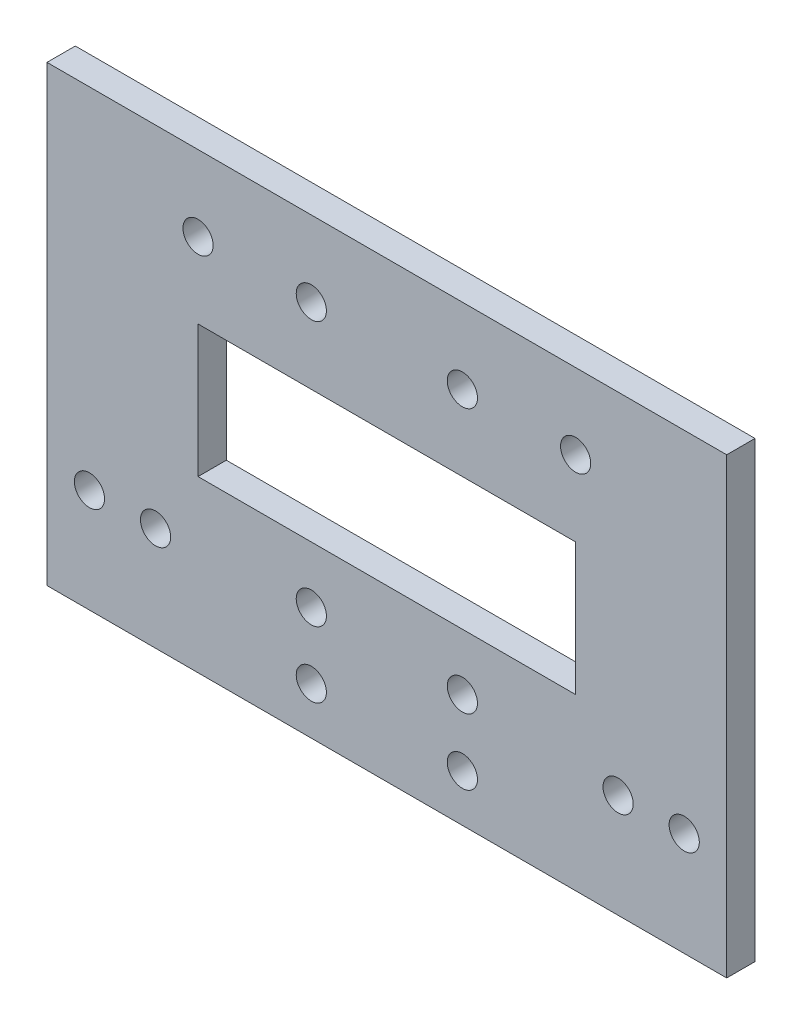
ISO-10303-21;
HEADER;
FILE_DESCRIPTION(('STEP AP214'),'2;1');
FILE_NAME('part.step','',(''),(''),'','','');
FILE_SCHEMA(('AUTOMOTIVE_DESIGN { 1 0 10303 214 1 1 1 1 }'));
ENDSEC;
DATA;
#1=APPLICATION_CONTEXT('core data for automotive mechanical design processes');
#2=APPLICATION_PROTOCOL_DEFINITION('international standard','automotive_design',2000,#1);
#3=PRODUCT_CONTEXT('',#1,'mechanical');
#4=PRODUCT('Part','Part','',(#3));
#5=PRODUCT_RELATED_PRODUCT_CATEGORY('part','',(#4));
#6=PRODUCT_DEFINITION_FORMATION('','',#4);
#7=PRODUCT_DEFINITION_CONTEXT('part definition',#1,'design');
#8=PRODUCT_DEFINITION('design','',#6,#7);
#9=PRODUCT_DEFINITION_SHAPE('','',#8);
#10=(LENGTH_UNIT() NAMED_UNIT(*) SI_UNIT(.MILLI.,.METRE.));
#11=(NAMED_UNIT(*) PLANE_ANGLE_UNIT() SI_UNIT($,.RADIAN.));
#12=(NAMED_UNIT(*) SI_UNIT($,.STERADIAN.) SOLID_ANGLE_UNIT());
#13=UNCERTAINTY_MEASURE_WITH_UNIT(LENGTH_MEASURE(1.E-05),#10,'distance_accuracy_value','');
#14=(GEOMETRIC_REPRESENTATION_CONTEXT(3) GLOBAL_UNCERTAINTY_ASSIGNED_CONTEXT((#13)) GLOBAL_UNIT_ASSIGNED_CONTEXT((#10,
#11,#12)) REPRESENTATION_CONTEXT('',''));
#15=CARTESIAN_POINT('',(0.,0.,0.));
#16=DIRECTION('',(0.,0.,1.));
#17=DIRECTION('',(1.,0.,0.));
#18=AXIS2_PLACEMENT_3D('',#15,#16,#17);
#19=CARTESIAN_POINT('',(0.,0.,3.));
#20=DIRECTION('',(0.,0.,-1.));
#21=DIRECTION('',(-1.,0.,0.));
#22=AXIS2_PLACEMENT_3D('',#19,#20,#21);
#23=PLANE('',#22);
#24=CARTESIAN_POINT('',(67.5,11.,3.));
#25=DIRECTION('',(0.,0.,1.));
#26=DIRECTION('',(1.,0.,0.));
#27=AXIS2_PLACEMENT_3D('',#24,#25,#26);
#28=CIRCLE('',#27,1.6);
#29=CARTESIAN_POINT('',(69.1,11.,3.));
#30=VERTEX_POINT('',#29);
#31=EDGE_CURVE('E272',#30,#30,#28,.T.);
#32=ORIENTED_EDGE('',*,*,#31,.F.);
#33=EDGE_LOOP('',(#32));
#34=FACE_BOUND('',#33,.T.);
#35=CARTESIAN_POINT('',(11.5,11.,3.));
#36=DIRECTION('',(0.,0.,1.));
#37=DIRECTION('',(1.,0.,0.));
#38=AXIS2_PLACEMENT_3D('',#35,#36,#37);
#39=CIRCLE('',#38,1.6);
#40=CARTESIAN_POINT('',(13.1,11.,3.));
#41=VERTEX_POINT('',#40);
#42=EDGE_CURVE('E285',#41,#41,#39,.T.);
#43=ORIENTED_EDGE('',*,*,#42,.F.);
#44=EDGE_LOOP('',(#43));
#45=FACE_BOUND('',#44,.T.);
#46=CARTESIAN_POINT('',(4.49999999999998,11.,3.));
#47=DIRECTION('',(0.,0.,1.));
#48=DIRECTION('',(1.,0.,0.));
#49=AXIS2_PLACEMENT_3D('',#46,#47,#48);
#50=CIRCLE('',#49,1.6);
#51=CARTESIAN_POINT('',(6.09999999999998,11.,3.));
#52=VERTEX_POINT('',#51);
#53=EDGE_CURVE('E284',#52,#52,#50,.T.);
#54=ORIENTED_EDGE('',*,*,#53,.F.);
#55=EDGE_LOOP('',(#54));
#56=FACE_BOUND('',#55,.T.);
#57=CARTESIAN_POINT('',(60.5,11.,3.));
#58=DIRECTION('',(0.,0.,1.));
#59=DIRECTION('',(1.,0.,0.));
#60=AXIS2_PLACEMENT_3D('',#57,#58,#59);
#61=CIRCLE('',#60,1.6);
#62=CARTESIAN_POINT('',(62.1,11.,3.));
#63=VERTEX_POINT('',#62);
#64=EDGE_CURVE('E278',#63,#63,#61,.T.);
#65=ORIENTED_EDGE('',*,*,#64,.F.);
#66=EDGE_LOOP('',(#65));
#67=FACE_BOUND('',#66,.T.);
#68=CARTESIAN_POINT('',(56.,40.,3.));
#69=DIRECTION('',(0.,0.,-1.));
#70=DIRECTION('',(-1.,0.,0.));
#71=AXIS2_PLACEMENT_3D('',#68,#69,#70);
#72=CIRCLE('',#71,1.6);
#73=CARTESIAN_POINT('',(54.4,40.,3.));
#74=VERTEX_POINT('',#73);
#75=EDGE_CURVE('E128',#74,#74,#72,.T.);
#76=ORIENTED_EDGE('',*,*,#75,.T.);
#77=EDGE_LOOP('',(#76));
#78=FACE_BOUND('',#77,.T.);
#79=CARTESIAN_POINT('',(28.,40.,3.));
#80=DIRECTION('',(0.,0.,-1.));
#81=DIRECTION('',(-1.,0.,0.));
#82=AXIS2_PLACEMENT_3D('',#79,#80,#81);
#83=CIRCLE('',#82,1.6);
#84=CARTESIAN_POINT('',(26.4,40.,3.));
#85=VERTEX_POINT('',#84);
#86=EDGE_CURVE('E336',#85,#85,#83,.T.);
#87=ORIENTED_EDGE('',*,*,#86,.T.);
#88=EDGE_LOOP('',(#87));
#89=FACE_BOUND('',#88,.T.);
#90=CARTESIAN_POINT('',(44.,40.,3.));
#91=DIRECTION('',(0.,0.,-1.));
#92=DIRECTION('',(-1.,0.,0.));
#93=AXIS2_PLACEMENT_3D('',#90,#91,#92);
#94=CIRCLE('',#93,1.6);
#95=CARTESIAN_POINT('',(42.4,40.,3.));
#96=VERTEX_POINT('',#95);
#97=EDGE_CURVE('E333',#96,#96,#94,.T.);
#98=ORIENTED_EDGE('',*,*,#97,.T.);
#99=EDGE_LOOP('',(#98));
#100=FACE_BOUND('',#99,.T.);
#101=CARTESIAN_POINT('',(28.,12.,3.));
#102=DIRECTION('',(0.,0.,-1.));
#103=DIRECTION('',(-1.,0.,0.));
#104=AXIS2_PLACEMENT_3D('',#101,#102,#103);
#105=CIRCLE('',#104,1.6);
#106=CARTESIAN_POINT('',(26.4,12.,3.));
#107=VERTEX_POINT('',#106);
#108=EDGE_CURVE('E330',#107,#107,#105,.T.);
#109=ORIENTED_EDGE('',*,*,#108,.T.);
#110=EDGE_LOOP('',(#109));
#111=FACE_BOUND('',#110,.T.);
#112=CARTESIAN_POINT('',(28.,5.,3.));
#113=DIRECTION('',(0.,0.,-1.));
#114=DIRECTION('',(-1.,0.,0.));
#115=AXIS2_PLACEMENT_3D('',#112,#113,#114);
#116=CIRCLE('',#115,1.6);
#117=CARTESIAN_POINT('',(26.4,5.,3.));
#118=VERTEX_POINT('',#117);
#119=EDGE_CURVE('E327',#118,#118,#116,.T.);
#120=ORIENTED_EDGE('',*,*,#119,.T.);
#121=EDGE_LOOP('',(#120));
#122=FACE_BOUND('',#121,.T.);
#123=CARTESIAN_POINT('',(44.,5.,3.));
#124=DIRECTION('',(0.,0.,-1.));
#125=DIRECTION('',(-1.,0.,0.));
#126=AXIS2_PLACEMENT_3D('',#123,#124,#125);
#127=CIRCLE('',#126,1.6);
#128=CARTESIAN_POINT('',(42.4,5.,3.));
#129=VERTEX_POINT('',#128);
#130=EDGE_CURVE('E324',#129,#129,#127,.T.);
#131=ORIENTED_EDGE('',*,*,#130,.T.);
#132=EDGE_LOOP('',(#131));
#133=FACE_BOUND('',#132,.T.);
#134=CARTESIAN_POINT('',(16.,40.,3.));
#135=DIRECTION('',(0.,0.,-1.));
#136=DIRECTION('',(-1.,0.,0.));
#137=AXIS2_PLACEMENT_3D('',#134,#135,#136);
#138=CIRCLE('',#137,1.6);
#139=CARTESIAN_POINT('',(14.4,40.,3.));
#140=VERTEX_POINT('',#139);
#141=EDGE_CURVE('E321',#140,#140,#138,.T.);
#142=ORIENTED_EDGE('',*,*,#141,.T.);
#143=EDGE_LOOP('',(#142));
#144=FACE_BOUND('',#143,.T.);
#145=CARTESIAN_POINT('',(44.,12.,3.));
#146=DIRECTION('',(0.,0.,-1.));
#147=DIRECTION('',(-1.,0.,0.));
#148=AXIS2_PLACEMENT_3D('',#145,#146,#147);
#149=CIRCLE('',#148,1.6);
#150=CARTESIAN_POINT('',(42.4,12.,3.));
#151=VERTEX_POINT('',#150);
#152=EDGE_CURVE('E318',#151,#151,#149,.T.);
#153=ORIENTED_EDGE('',*,*,#152,.T.);
#154=EDGE_LOOP('',(#153));
#155=FACE_BOUND('',#154,.T.);
#156=DIRECTION('',(1.,0.,0.));
#157=VECTOR('',#156,1.);
#158=CARTESIAN_POINT('',(16.,0.,3.));
#159=LINE('',#158,#157);
#160=CARTESIAN_POINT('',(0.,0.,3.));
#161=VERTEX_POINT('',#160);
#162=CARTESIAN_POINT('',(72.,0.,3.));
#163=VERTEX_POINT('',#162);
#164=EDGE_CURVE('E138',#161,#163,#159,.T.);
#165=ORIENTED_EDGE('',*,*,#164,.T.);
#166=DIRECTION('',(0.,1.,0.));
#167=VECTOR('',#166,1.);
#168=CARTESIAN_POINT('',(72.,48.,3.));
#169=LINE('',#168,#167);
#170=CARTESIAN_POINT('',(72.,48.,3.));
#171=VERTEX_POINT('',#170);
#172=EDGE_CURVE('E140',#163,#171,#169,.T.);
#173=ORIENTED_EDGE('',*,*,#172,.T.);
#174=DIRECTION('',(-1.,0.,0.));
#175=VECTOR('',#174,1.);
#176=CARTESIAN_POINT('',(0.,48.,3.));
#177=LINE('',#176,#175);
#178=CARTESIAN_POINT('',(0.,48.,3.));
#179=VERTEX_POINT('',#178);
#180=EDGE_CURVE('E143',#171,#179,#177,.T.);
#181=ORIENTED_EDGE('',*,*,#180,.T.);
#182=DIRECTION('',(0.,-1.,0.));
#183=VECTOR('',#182,1.);
#184=CARTESIAN_POINT('',(0.,0.,3.));
#185=LINE('',#184,#183);
#186=EDGE_CURVE('E145',#179,#161,#185,.T.);
#187=ORIENTED_EDGE('',*,*,#186,.T.);
#188=EDGE_LOOP('',(#165,#173,#181,#187));
#189=FACE_BOUND('',#188,.T.);
#190=DIRECTION('',(0.,-1.,0.));
#191=VECTOR('',#190,1.);
#192=CARTESIAN_POINT('',(16.,18.,3.));
#193=LINE('',#192,#191);
#194=CARTESIAN_POINT('',(16.,32.,3.));
#195=VERTEX_POINT('',#194);
#196=CARTESIAN_POINT('',(16.,18.,3.));
#197=VERTEX_POINT('',#196);
#198=EDGE_CURVE('E100',#195,#197,#193,.T.);
#199=ORIENTED_EDGE('',*,*,#198,.F.);
#200=DIRECTION('',(-1.,0.,0.));
#201=VECTOR('',#200,1.);
#202=CARTESIAN_POINT('',(56.,32.,3.));
#203=LINE('',#202,#201);
#204=CARTESIAN_POINT('',(56.,32.,3.));
#205=VERTEX_POINT('',#204);
#206=EDGE_CURVE('E122',#205,#195,#203,.T.);
#207=ORIENTED_EDGE('',*,*,#206,.F.);
#208=DIRECTION('',(0.,1.,0.));
#209=VECTOR('',#208,1.);
#210=CARTESIAN_POINT('',(56.,32.,3.));
#211=LINE('',#210,#209);
#212=CARTESIAN_POINT('',(56.,18.,3.));
#213=VERTEX_POINT('',#212);
#214=EDGE_CURVE('E120',#213,#205,#211,.T.);
#215=ORIENTED_EDGE('',*,*,#214,.F.);
#216=DIRECTION('',(1.,0.,0.));
#217=VECTOR('',#216,1.);
#218=CARTESIAN_POINT('',(16.,18.,3.));
#219=LINE('',#218,#217);
#220=EDGE_CURVE('E108',#197,#213,#219,.T.);
#221=ORIENTED_EDGE('',*,*,#220,.F.);
#222=EDGE_LOOP('',(#199,#207,#215,#221));
#223=FACE_BOUND('',#222,.T.);
#224=ADVANCED_FACE('F35',(#34,#45,#56,#67,#78,#89,#100,#111,#122,#133,#144,#155,#189,#223),#23,.F.);
#225=CARTESIAN_POINT('',(0.,0.,0.));
#226=DIRECTION('',(0.,0.,-1.));
#227=DIRECTION('',(-1.,0.,0.));
#228=AXIS2_PLACEMENT_3D('',#225,#226,#227);
#229=PLANE('',#228);
#230=CARTESIAN_POINT('',(67.5,11.,0.));
#231=DIRECTION('',(0.,0.,1.));
#232=DIRECTION('',(1.,0.,0.));
#233=AXIS2_PLACEMENT_3D('',#230,#231,#232);
#234=CIRCLE('',#233,1.6);
#235=CARTESIAN_POINT('',(69.1,11.,0.));
#236=VERTEX_POINT('',#235);
#237=EDGE_CURVE('E270',#236,#236,#234,.T.);
#238=ORIENTED_EDGE('',*,*,#237,.T.);
#239=EDGE_LOOP('',(#238));
#240=FACE_BOUND('',#239,.T.);
#241=CARTESIAN_POINT('',(11.5,11.,0.));
#242=DIRECTION('',(0.,0.,1.));
#243=DIRECTION('',(1.,0.,0.));
#244=AXIS2_PLACEMENT_3D('',#241,#242,#243);
#245=CIRCLE('',#244,1.6);
#246=CARTESIAN_POINT('',(13.1,11.,0.));
#247=VERTEX_POINT('',#246);
#248=EDGE_CURVE('E281',#247,#247,#245,.T.);
#249=ORIENTED_EDGE('',*,*,#248,.T.);
#250=EDGE_LOOP('',(#249));
#251=FACE_BOUND('',#250,.T.);
#252=CARTESIAN_POINT('',(4.49999999999998,11.,0.));
#253=DIRECTION('',(0.,0.,1.));
#254=DIRECTION('',(1.,0.,0.));
#255=AXIS2_PLACEMENT_3D('',#252,#253,#254);
#256=CIRCLE('',#255,1.6);
#257=CARTESIAN_POINT('',(6.09999999999998,11.,0.));
#258=VERTEX_POINT('',#257);
#259=EDGE_CURVE('E290',#258,#258,#256,.T.);
#260=ORIENTED_EDGE('',*,*,#259,.T.);
#261=EDGE_LOOP('',(#260));
#262=FACE_BOUND('',#261,.T.);
#263=CARTESIAN_POINT('',(60.5,11.,0.));
#264=DIRECTION('',(0.,0.,1.));
#265=DIRECTION('',(1.,0.,0.));
#266=AXIS2_PLACEMENT_3D('',#263,#264,#265);
#267=CIRCLE('',#266,1.6);
#268=CARTESIAN_POINT('',(62.1,11.,0.));
#269=VERTEX_POINT('',#268);
#270=EDGE_CURVE('E273',#269,#269,#267,.T.);
#271=ORIENTED_EDGE('',*,*,#270,.T.);
#272=EDGE_LOOP('',(#271));
#273=FACE_BOUND('',#272,.T.);
#274=CARTESIAN_POINT('',(56.,40.,0.));
#275=DIRECTION('',(0.,0.,-1.));
#276=DIRECTION('',(-1.,0.,0.));
#277=AXIS2_PLACEMENT_3D('',#274,#275,#276);
#278=CIRCLE('',#277,1.6);
#279=CARTESIAN_POINT('',(54.4,40.,0.));
#280=VERTEX_POINT('',#279);
#281=EDGE_CURVE('E301',#280,#280,#278,.T.);
#282=ORIENTED_EDGE('',*,*,#281,.F.);
#283=EDGE_LOOP('',(#282));
#284=FACE_BOUND('',#283,.T.);
#285=CARTESIAN_POINT('',(28.,40.,0.));
#286=DIRECTION('',(0.,0.,-1.));
#287=DIRECTION('',(-1.,0.,0.));
#288=AXIS2_PLACEMENT_3D('',#285,#286,#287);
#289=CIRCLE('',#288,1.6);
#290=CARTESIAN_POINT('',(26.4,40.,0.));
#291=VERTEX_POINT('',#290);
#292=EDGE_CURVE('E304',#291,#291,#289,.T.);
#293=ORIENTED_EDGE('',*,*,#292,.F.);
#294=EDGE_LOOP('',(#293));
#295=FACE_BOUND('',#294,.T.);
#296=CARTESIAN_POINT('',(44.,40.,0.));
#297=DIRECTION('',(0.,0.,-1.));
#298=DIRECTION('',(-1.,0.,0.));
#299=AXIS2_PLACEMENT_3D('',#296,#297,#298);
#300=CIRCLE('',#299,1.6);
#301=CARTESIAN_POINT('',(42.4,40.,0.));
#302=VERTEX_POINT('',#301);
#303=EDGE_CURVE('E307',#302,#302,#300,.T.);
#304=ORIENTED_EDGE('',*,*,#303,.F.);
#305=EDGE_LOOP('',(#304));
#306=FACE_BOUND('',#305,.T.);
#307=CARTESIAN_POINT('',(28.,12.,0.));
#308=DIRECTION('',(0.,0.,-1.));
#309=DIRECTION('',(-1.,0.,0.));
#310=AXIS2_PLACEMENT_3D('',#307,#308,#309);
#311=CIRCLE('',#310,1.6);
#312=CARTESIAN_POINT('',(26.4,12.,0.));
#313=VERTEX_POINT('',#312);
#314=EDGE_CURVE('E310',#313,#313,#311,.T.);
#315=ORIENTED_EDGE('',*,*,#314,.F.);
#316=EDGE_LOOP('',(#315));
#317=FACE_BOUND('',#316,.T.);
#318=CARTESIAN_POINT('',(28.,5.,0.));
#319=DIRECTION('',(0.,0.,-1.));
#320=DIRECTION('',(-1.,0.,0.));
#321=AXIS2_PLACEMENT_3D('',#318,#319,#320);
#322=CIRCLE('',#321,1.6);
#323=CARTESIAN_POINT('',(26.4,5.,0.));
#324=VERTEX_POINT('',#323);
#325=EDGE_CURVE('E275',#324,#324,#322,.T.);
#326=ORIENTED_EDGE('',*,*,#325,.F.);
#327=EDGE_LOOP('',(#326));
#328=FACE_BOUND('',#327,.T.);
#329=CARTESIAN_POINT('',(44.,5.,0.));
#330=DIRECTION('',(0.,0.,-1.));
#331=DIRECTION('',(-1.,0.,0.));
#332=AXIS2_PLACEMENT_3D('',#329,#330,#331);
#333=CIRCLE('',#332,1.6);
#334=CARTESIAN_POINT('',(42.4,5.,0.));
#335=VERTEX_POINT('',#334);
#336=EDGE_CURVE('E297',#335,#335,#333,.T.);
#337=ORIENTED_EDGE('',*,*,#336,.F.);
#338=EDGE_LOOP('',(#337));
#339=FACE_BOUND('',#338,.T.);
#340=CARTESIAN_POINT('',(16.,40.,0.));
#341=DIRECTION('',(0.,0.,-1.));
#342=DIRECTION('',(-1.,0.,0.));
#343=AXIS2_PLACEMENT_3D('',#340,#341,#342);
#344=CIRCLE('',#343,1.6);
#345=CARTESIAN_POINT('',(14.4,40.,0.));
#346=VERTEX_POINT('',#345);
#347=EDGE_CURVE('E298',#346,#346,#344,.T.);
#348=ORIENTED_EDGE('',*,*,#347,.F.);
#349=EDGE_LOOP('',(#348));
#350=FACE_BOUND('',#349,.T.);
#351=CARTESIAN_POINT('',(44.,12.,0.));
#352=DIRECTION('',(0.,0.,-1.));
#353=DIRECTION('',(-1.,0.,0.));
#354=AXIS2_PLACEMENT_3D('',#351,#352,#353);
#355=CIRCLE('',#354,1.6);
#356=CARTESIAN_POINT('',(42.4,12.,0.));
#357=VERTEX_POINT('',#356);
#358=EDGE_CURVE('E313',#357,#357,#355,.T.);
#359=ORIENTED_EDGE('',*,*,#358,.F.);
#360=EDGE_LOOP('',(#359));
#361=FACE_BOUND('',#360,.T.);
#362=DIRECTION('',(1.,0.,0.));
#363=VECTOR('',#362,1.);
#364=CARTESIAN_POINT('',(72.,0.,0.));
#365=LINE('',#364,#363);
#366=CARTESIAN_POINT('',(0.,0.,0.));
#367=VERTEX_POINT('',#366);
#368=CARTESIAN_POINT('',(72.,0.,0.));
#369=VERTEX_POINT('',#368);
#370=EDGE_CURVE('E116',#367,#369,#365,.T.);
#371=ORIENTED_EDGE('',*,*,#370,.F.);
#372=DIRECTION('',(0.,-1.,0.));
#373=VECTOR('',#372,1.);
#374=CARTESIAN_POINT('',(0.,0.,0.));
#375=LINE('',#374,#373);
#376=CARTESIAN_POINT('',(0.,48.,0.));
#377=VERTEX_POINT('',#376);
#378=EDGE_CURVE('E141',#377,#367,#375,.T.);
#379=ORIENTED_EDGE('',*,*,#378,.F.);
#380=DIRECTION('',(-1.,0.,0.));
#381=VECTOR('',#380,1.);
#382=CARTESIAN_POINT('',(0.,48.,0.));
#383=LINE('',#382,#381);
#384=CARTESIAN_POINT('',(72.,48.,0.));
#385=VERTEX_POINT('',#384);
#386=EDGE_CURVE('E151',#385,#377,#383,.T.);
#387=ORIENTED_EDGE('',*,*,#386,.F.);
#388=DIRECTION('',(0.,1.,0.));
#389=VECTOR('',#388,1.);
#390=CARTESIAN_POINT('',(72.,48.,0.));
#391=LINE('',#390,#389);
#392=EDGE_CURVE('E149',#369,#385,#391,.T.);
#393=ORIENTED_EDGE('',*,*,#392,.F.);
#394=EDGE_LOOP('',(#371,#379,#387,#393));
#395=FACE_BOUND('',#394,.T.);
#396=DIRECTION('',(-1.,0.,0.));
#397=VECTOR('',#396,1.);
#398=CARTESIAN_POINT('',(56.,32.,0.));
#399=LINE('',#398,#397);
#400=CARTESIAN_POINT('',(56.,32.,0.));
#401=VERTEX_POINT('',#400);
#402=CARTESIAN_POINT('',(16.,32.,0.));
#403=VERTEX_POINT('',#402);
#404=EDGE_CURVE('E109',#401,#403,#399,.T.);
#405=ORIENTED_EDGE('',*,*,#404,.T.);
#406=DIRECTION('',(0.,-1.,0.));
#407=VECTOR('',#406,1.);
#408=CARTESIAN_POINT('',(16.,18.,0.));
#409=LINE('',#408,#407);
#410=CARTESIAN_POINT('',(16.,18.,0.));
#411=VERTEX_POINT('',#410);
#412=EDGE_CURVE('E58',#403,#411,#409,.T.);
#413=ORIENTED_EDGE('',*,*,#412,.T.);
#414=DIRECTION('',(1.,0.,0.));
#415=VECTOR('',#414,1.);
#416=CARTESIAN_POINT('',(16.,18.,0.));
#417=LINE('',#416,#415);
#418=CARTESIAN_POINT('',(56.,18.,0.));
#419=VERTEX_POINT('',#418);
#420=EDGE_CURVE('E115',#411,#419,#417,.T.);
#421=ORIENTED_EDGE('',*,*,#420,.T.);
#422=DIRECTION('',(0.,1.,0.));
#423=VECTOR('',#422,1.);
#424=CARTESIAN_POINT('',(56.,32.,0.));
#425=LINE('',#424,#423);
#426=EDGE_CURVE('E130',#419,#401,#425,.T.);
#427=ORIENTED_EDGE('',*,*,#426,.T.);
#428=EDGE_LOOP('',(#405,#413,#421,#427));
#429=FACE_BOUND('',#428,.T.);
#430=ADVANCED_FACE('F171',(#240,#251,#262,#273,#284,#295,#306,#317,#328,#339,#350,#361,#395,
#429),#229,.T.);
#431=CARTESIAN_POINT('',(72.,0.,3.));
#432=DIRECTION('',(0.,1.,0.));
#433=DIRECTION('',(-1.,0.,0.));
#434=AXIS2_PLACEMENT_3D('',#431,#432,#433);
#435=PLANE('',#434);
#436=ORIENTED_EDGE('',*,*,#370,.T.);
#437=DIRECTION('',(0.,0.,-1.));
#438=VECTOR('',#437,1.);
#439=CARTESIAN_POINT('',(72.,0.,3.));
#440=LINE('',#439,#438);
#441=EDGE_CURVE('E11',#163,#369,#440,.T.);
#442=ORIENTED_EDGE('',*,*,#441,.F.);
#443=ORIENTED_EDGE('',*,*,#164,.F.);
#444=DIRECTION('',(0.,0.,-1.));
#445=VECTOR('',#444,1.);
#446=CARTESIAN_POINT('',(0.,0.,3.));
#447=LINE('',#446,#445);
#448=EDGE_CURVE('E147',#161,#367,#447,.T.);
#449=ORIENTED_EDGE('',*,*,#448,.T.);
#450=EDGE_LOOP('',(#436,#442,#443,#449));
#451=FACE_BOUND('',#450,.T.);
#452=ADVANCED_FACE('F37',(#451),#435,.F.);
#453=CARTESIAN_POINT('',(72.,48.,3.));
#454=DIRECTION('',(-1.,0.,0.));
#455=DIRECTION('',(0.,0.,1.));
#456=AXIS2_PLACEMENT_3D('',#453,#454,#455);
#457=PLANE('',#456);
#458=ORIENTED_EDGE('',*,*,#392,.T.);
#459=DIRECTION('',(0.,0.,-1.));
#460=VECTOR('',#459,1.);
#461=CARTESIAN_POINT('',(72.,48.,3.));
#462=LINE('',#461,#460);
#463=EDGE_CURVE('E43',#171,#385,#462,.T.);
#464=ORIENTED_EDGE('',*,*,#463,.F.);
#465=ORIENTED_EDGE('',*,*,#172,.F.);
#466=ORIENTED_EDGE('',*,*,#441,.T.);
#467=EDGE_LOOP('',(#458,#464,#465,#466));
#468=FACE_BOUND('',#467,.T.);
#469=ADVANCED_FACE('F181',(#468),#457,.F.);
#470=CARTESIAN_POINT('',(0.,48.,3.));
#471=DIRECTION('',(0.,-1.,0.));
#472=DIRECTION('',(1.,0.,0.));
#473=AXIS2_PLACEMENT_3D('',#470,#471,#472);
#474=PLANE('',#473);
#475=ORIENTED_EDGE('',*,*,#386,.T.);
#476=DIRECTION('',(0.,0.,-1.));
#477=VECTOR('',#476,1.);
#478=CARTESIAN_POINT('',(0.,48.,3.));
#479=LINE('',#478,#477);
#480=EDGE_CURVE('E157',#179,#377,#479,.T.);
#481=ORIENTED_EDGE('',*,*,#480,.F.);
#482=ORIENTED_EDGE('',*,*,#180,.F.);
#483=ORIENTED_EDGE('',*,*,#463,.T.);
#484=EDGE_LOOP('',(#475,#481,#482,#483));
#485=FACE_BOUND('',#484,.T.);
#486=ADVANCED_FACE('F164',(#485),#474,.F.);
#487=CARTESIAN_POINT('',(0.,0.,3.));
#488=DIRECTION('',(1.,0.,0.));
#489=DIRECTION('',(0.,1.,0.));
#490=AXIS2_PLACEMENT_3D('',#487,#488,#489);
#491=PLANE('',#490);
#492=ORIENTED_EDGE('',*,*,#378,.T.);
#493=ORIENTED_EDGE('',*,*,#448,.F.);
#494=ORIENTED_EDGE('',*,*,#186,.F.);
#495=ORIENTED_EDGE('',*,*,#480,.T.);
#496=EDGE_LOOP('',(#492,#493,#494,#495));
#497=FACE_BOUND('',#496,.T.);
#498=ADVANCED_FACE('F175',(#497),#491,.F.);
#499=CARTESIAN_POINT('',(16.,18.,3.));
#500=DIRECTION('',(1.,0.,0.));
#501=DIRECTION('',(0.,1.,0.));
#502=AXIS2_PLACEMENT_3D('',#499,#500,#501);
#503=PLANE('',#502);
#504=ORIENTED_EDGE('',*,*,#412,.F.);
#505=DIRECTION('',(0.,0.,-1.));
#506=VECTOR('',#505,1.);
#507=CARTESIAN_POINT('',(16.,32.,3.));
#508=LINE('',#507,#506);
#509=EDGE_CURVE('E104',#195,#403,#508,.T.);
#510=ORIENTED_EDGE('',*,*,#509,.F.);
#511=ORIENTED_EDGE('',*,*,#198,.T.);
#512=DIRECTION('',(0.,0.,-1.));
#513=VECTOR('',#512,1.);
#514=CARTESIAN_POINT('',(16.,18.,3.));
#515=LINE('',#514,#513);
#516=EDGE_CURVE('E103',#197,#411,#515,.T.);
#517=ORIENTED_EDGE('',*,*,#516,.T.);
#518=EDGE_LOOP('',(#504,#510,#511,#517));
#519=FACE_BOUND('',#518,.T.);
#520=ADVANCED_FACE('F102',(#519),#503,.T.);
#521=CARTESIAN_POINT('',(16.,18.,3.));
#522=DIRECTION('',(0.,1.,0.));
#523=DIRECTION('',(0.,0.,1.));
#524=AXIS2_PLACEMENT_3D('',#521,#522,#523);
#525=PLANE('',#524);
#526=ORIENTED_EDGE('',*,*,#420,.F.);
#527=ORIENTED_EDGE('',*,*,#516,.F.);
#528=ORIENTED_EDGE('',*,*,#220,.T.);
#529=DIRECTION('',(0.,0.,-1.));
#530=VECTOR('',#529,1.);
#531=CARTESIAN_POINT('',(56.,18.,3.));
#532=LINE('',#531,#530);
#533=EDGE_CURVE('E117',#213,#419,#532,.T.);
#534=ORIENTED_EDGE('',*,*,#533,.T.);
#535=EDGE_LOOP('',(#526,#527,#528,#534));
#536=FACE_BOUND('',#535,.T.);
#537=ADVANCED_FACE('F112',(#536),#525,.T.);
#538=CARTESIAN_POINT('',(56.,32.,3.));
#539=DIRECTION('',(-1.,0.,0.));
#540=DIRECTION('',(0.,0.,1.));
#541=AXIS2_PLACEMENT_3D('',#538,#539,#540);
#542=PLANE('',#541);
#543=ORIENTED_EDGE('',*,*,#426,.F.);
#544=ORIENTED_EDGE('',*,*,#533,.F.);
#545=ORIENTED_EDGE('',*,*,#214,.T.);
#546=DIRECTION('',(0.,0.,-1.));
#547=VECTOR('',#546,1.);
#548=CARTESIAN_POINT('',(56.,32.,3.));
#549=LINE('',#548,#547);
#550=EDGE_CURVE('E50',#205,#401,#549,.T.);
#551=ORIENTED_EDGE('',*,*,#550,.T.);
#552=EDGE_LOOP('',(#543,#544,#545,#551));
#553=FACE_BOUND('',#552,.T.);
#554=ADVANCED_FACE('F208',(#553),#542,.T.);
#555=CARTESIAN_POINT('',(56.,32.,3.));
#556=DIRECTION('',(0.,-1.,0.));
#557=DIRECTION('',(1.,0.,0.));
#558=AXIS2_PLACEMENT_3D('',#555,#556,#557);
#559=PLANE('',#558);
#560=ORIENTED_EDGE('',*,*,#404,.F.);
#561=ORIENTED_EDGE('',*,*,#550,.F.);
#562=ORIENTED_EDGE('',*,*,#206,.T.);
#563=ORIENTED_EDGE('',*,*,#509,.T.);
#564=EDGE_LOOP('',(#560,#561,#562,#563));
#565=FACE_BOUND('',#564,.T.);
#566=ADVANCED_FACE('F212',(#565),#559,.T.);
#567=CARTESIAN_POINT('',(44.,12.,10.));
#568=DIRECTION('',(0.,0.,-1.));
#569=DIRECTION('',(-1.,0.,0.));
#570=AXIS2_PLACEMENT_3D('',#567,#568,#569);
#571=CYLINDRICAL_SURFACE('',#570,1.6);
#572=ORIENTED_EDGE('',*,*,#358,.T.);
#573=EDGE_LOOP('',(#572));
#574=FACE_BOUND('',#573,.T.);
#575=ORIENTED_EDGE('',*,*,#152,.F.);
#576=EDGE_LOOP('',(#575));
#577=FACE_BOUND('',#576,.T.);
#578=ADVANCED_FACE('F218',(#574,#577),#571,.F.);
#579=CARTESIAN_POINT('',(16.,40.,10.));
#580=DIRECTION('',(0.,0.,-1.));
#581=DIRECTION('',(-1.,0.,0.));
#582=AXIS2_PLACEMENT_3D('',#579,#580,#581);
#583=CYLINDRICAL_SURFACE('',#582,1.6);
#584=ORIENTED_EDGE('',*,*,#347,.T.);
#585=EDGE_LOOP('',(#584));
#586=FACE_BOUND('',#585,.T.);
#587=ORIENTED_EDGE('',*,*,#141,.F.);
#588=EDGE_LOOP('',(#587));
#589=FACE_BOUND('',#588,.T.);
#590=ADVANCED_FACE('F221',(#586,#589),#583,.F.);
#591=CARTESIAN_POINT('',(44.,5.,10.));
#592=DIRECTION('',(0.,0.,-1.));
#593=DIRECTION('',(-1.,0.,0.));
#594=AXIS2_PLACEMENT_3D('',#591,#592,#593);
#595=CYLINDRICAL_SURFACE('',#594,1.6);
#596=ORIENTED_EDGE('',*,*,#336,.T.);
#597=EDGE_LOOP('',(#596));
#598=FACE_BOUND('',#597,.T.);
#599=ORIENTED_EDGE('',*,*,#130,.F.);
#600=EDGE_LOOP('',(#599));
#601=FACE_BOUND('',#600,.T.);
#602=ADVANCED_FACE('F241',(#598,#601),#595,.F.);
#603=CARTESIAN_POINT('',(28.,5.,10.));
#604=DIRECTION('',(0.,0.,-1.));
#605=DIRECTION('',(-1.,0.,0.));
#606=AXIS2_PLACEMENT_3D('',#603,#604,#605);
#607=CYLINDRICAL_SURFACE('',#606,1.6);
#608=ORIENTED_EDGE('',*,*,#325,.T.);
#609=EDGE_LOOP('',(#608));
#610=FACE_BOUND('',#609,.T.);
#611=ORIENTED_EDGE('',*,*,#119,.F.);
#612=EDGE_LOOP('',(#611));
#613=FACE_BOUND('',#612,.T.);
#614=ADVANCED_FACE('F231',(#610,#613),#607,.F.);
#615=CARTESIAN_POINT('',(28.,12.,10.));
#616=DIRECTION('',(0.,0.,-1.));
#617=DIRECTION('',(-1.,0.,0.));
#618=AXIS2_PLACEMENT_3D('',#615,#616,#617);
#619=CYLINDRICAL_SURFACE('',#618,1.6);
#620=ORIENTED_EDGE('',*,*,#314,.T.);
#621=EDGE_LOOP('',(#620));
#622=FACE_BOUND('',#621,.T.);
#623=ORIENTED_EDGE('',*,*,#108,.F.);
#624=EDGE_LOOP('',(#623));
#625=FACE_BOUND('',#624,.T.);
#626=ADVANCED_FACE('F227',(#622,#625),#619,.F.);
#627=CARTESIAN_POINT('',(44.,40.,10.));
#628=DIRECTION('',(0.,0.,-1.));
#629=DIRECTION('',(-1.,0.,0.));
#630=AXIS2_PLACEMENT_3D('',#627,#628,#629);
#631=CYLINDRICAL_SURFACE('',#630,1.6);
#632=ORIENTED_EDGE('',*,*,#303,.T.);
#633=EDGE_LOOP('',(#632));
#634=FACE_BOUND('',#633,.T.);
#635=ORIENTED_EDGE('',*,*,#97,.F.);
#636=EDGE_LOOP('',(#635));
#637=FACE_BOUND('',#636,.T.);
#638=ADVANCED_FACE('F223',(#634,#637),#631,.F.);
#639=CARTESIAN_POINT('',(28.,40.,10.));
#640=DIRECTION('',(0.,0.,-1.));
#641=DIRECTION('',(-1.,0.,0.));
#642=AXIS2_PLACEMENT_3D('',#639,#640,#641);
#643=CYLINDRICAL_SURFACE('',#642,1.6);
#644=ORIENTED_EDGE('',*,*,#292,.T.);
#645=EDGE_LOOP('',(#644));
#646=FACE_BOUND('',#645,.T.);
#647=ORIENTED_EDGE('',*,*,#86,.F.);
#648=EDGE_LOOP('',(#647));
#649=FACE_BOUND('',#648,.T.);
#650=ADVANCED_FACE('F226',(#646,#649),#643,.F.);
#651=CARTESIAN_POINT('',(56.,40.,10.));
#652=DIRECTION('',(0.,0.,-1.));
#653=DIRECTION('',(-1.,0.,0.));
#654=AXIS2_PLACEMENT_3D('',#651,#652,#653);
#655=CYLINDRICAL_SURFACE('',#654,1.6);
#656=ORIENTED_EDGE('',*,*,#281,.T.);
#657=EDGE_LOOP('',(#656));
#658=FACE_BOUND('',#657,.T.);
#659=ORIENTED_EDGE('',*,*,#75,.F.);
#660=EDGE_LOOP('',(#659));
#661=FACE_BOUND('',#660,.T.);
#662=ADVANCED_FACE('F233',(#658,#661),#655,.F.);
#663=CARTESIAN_POINT('',(60.5,11.,0.));
#664=DIRECTION('',(0.,0.,1.));
#665=DIRECTION('',(1.,0.,0.));
#666=AXIS2_PLACEMENT_3D('',#663,#664,#665);
#667=CYLINDRICAL_SURFACE('',#666,1.6);
#668=ORIENTED_EDGE('',*,*,#270,.F.);
#669=EDGE_LOOP('',(#668));
#670=FACE_BOUND('',#669,.T.);
#671=ORIENTED_EDGE('',*,*,#64,.T.);
#672=EDGE_LOOP('',(#671));
#673=FACE_BOUND('',#672,.T.);
#674=ADVANCED_FACE('F236',(#670,#673),#667,.F.);
#675=CARTESIAN_POINT('',(4.49999999999998,11.,0.));
#676=DIRECTION('',(0.,0.,1.));
#677=DIRECTION('',(1.,0.,0.));
#678=AXIS2_PLACEMENT_3D('',#675,#676,#677);
#679=CYLINDRICAL_SURFACE('',#678,1.6);
#680=ORIENTED_EDGE('',*,*,#259,.F.);
#681=EDGE_LOOP('',(#680));
#682=FACE_BOUND('',#681,.T.);
#683=ORIENTED_EDGE('',*,*,#53,.T.);
#684=EDGE_LOOP('',(#683));
#685=FACE_BOUND('',#684,.T.);
#686=ADVANCED_FACE('F251',(#682,#685),#679,.F.);
#687=CARTESIAN_POINT('',(11.5,11.,0.));
#688=DIRECTION('',(0.,0.,1.));
#689=DIRECTION('',(1.,0.,0.));
#690=AXIS2_PLACEMENT_3D('',#687,#688,#689);
#691=CYLINDRICAL_SURFACE('',#690,1.6);
#692=ORIENTED_EDGE('',*,*,#248,.F.);
#693=EDGE_LOOP('',(#692));
#694=FACE_BOUND('',#693,.T.);
#695=ORIENTED_EDGE('',*,*,#42,.T.);
#696=EDGE_LOOP('',(#695));
#697=FACE_BOUND('',#696,.T.);
#698=ADVANCED_FACE('F254',(#694,#697),#691,.F.);
#699=CARTESIAN_POINT('',(67.5,11.,0.));
#700=DIRECTION('',(0.,0.,1.));
#701=DIRECTION('',(1.,0.,0.));
#702=AXIS2_PLACEMENT_3D('',#699,#700,#701);
#703=CYLINDRICAL_SURFACE('',#702,1.6);
#704=ORIENTED_EDGE('',*,*,#237,.F.);
#705=EDGE_LOOP('',(#704));
#706=FACE_BOUND('',#705,.T.);
#707=ORIENTED_EDGE('',*,*,#31,.T.);
#708=EDGE_LOOP('',(#707));
#709=FACE_BOUND('',#708,.T.);
#710=ADVANCED_FACE('F261',(#706,#709),#703,.F.);
#711=CLOSED_SHELL('',(#224,#430,#452,#469,#486,#498,#520,#537,#554,#566,#578,#590,#602,#614,
#626,#638,#650,#662,#674,#686,#698,#710));
#712=MANIFOLD_SOLID_BREP('B2',#711);
#713=ADVANCED_BREP_SHAPE_REPRESENTATION('',(#18,#712),#14);
#714=SHAPE_DEFINITION_REPRESENTATION(#9,#713);
ENDSEC;
END-ISO-10303-21;
